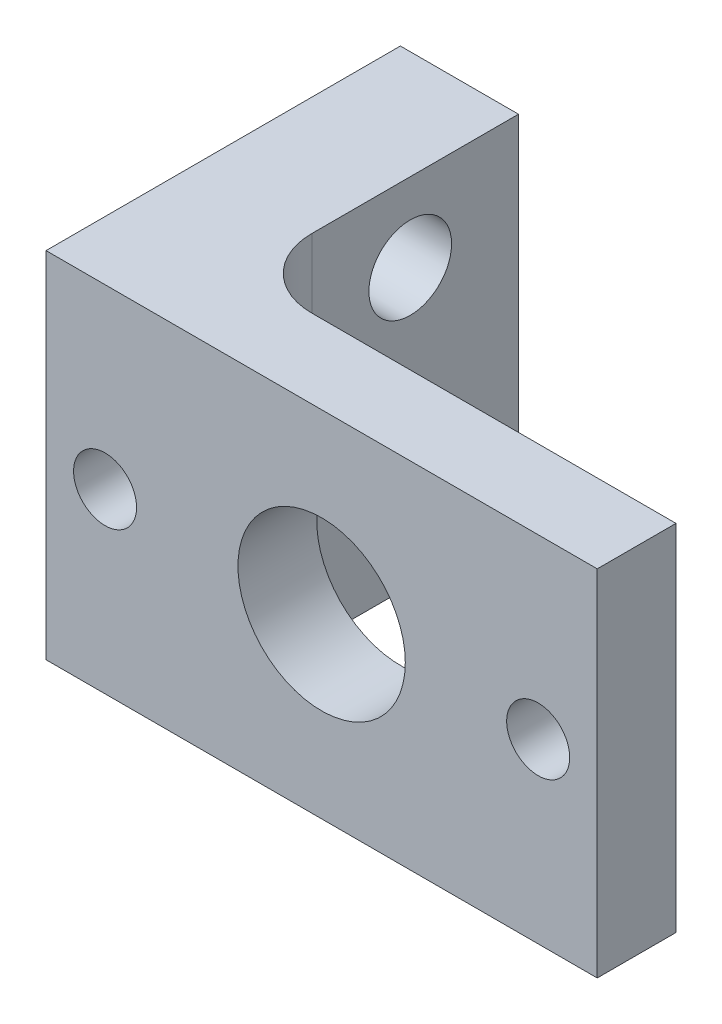
ISO-10303-21;
HEADER;
FILE_DESCRIPTION(('STEP AP214'),'2;1');
FILE_NAME('part.step','',(''),(''),'','','');
FILE_SCHEMA(('AUTOMOTIVE_DESIGN { 1 0 10303 214 1 1 1 1 }'));
ENDSEC;
DATA;
#1=APPLICATION_CONTEXT('core data for automotive mechanical design processes');
#2=APPLICATION_PROTOCOL_DEFINITION('international standard','automotive_design',2000,#1);
#3=PRODUCT_CONTEXT('',#1,'mechanical');
#4=PRODUCT('Part','Part','',(#3));
#5=PRODUCT_RELATED_PRODUCT_CATEGORY('part','',(#4));
#6=PRODUCT_DEFINITION_FORMATION('','',#4);
#7=PRODUCT_DEFINITION_CONTEXT('part definition',#1,'design');
#8=PRODUCT_DEFINITION('design','',#6,#7);
#9=PRODUCT_DEFINITION_SHAPE('','',#8);
#10=(LENGTH_UNIT() NAMED_UNIT(*) SI_UNIT(.MILLI.,.METRE.));
#11=(NAMED_UNIT(*) PLANE_ANGLE_UNIT() SI_UNIT($,.RADIAN.));
#12=(NAMED_UNIT(*) SI_UNIT($,.STERADIAN.) SOLID_ANGLE_UNIT());
#13=UNCERTAINTY_MEASURE_WITH_UNIT(LENGTH_MEASURE(1.E-05),#10,'distance_accuracy_value','');
#14=(GEOMETRIC_REPRESENTATION_CONTEXT(3) GLOBAL_UNCERTAINTY_ASSIGNED_CONTEXT((#13)) GLOBAL_UNIT_ASSIGNED_CONTEXT((#10,
#11,#12)) REPRESENTATION_CONTEXT('',''));
#15=CARTESIAN_POINT('',(0.,0.,0.));
#16=DIRECTION('',(0.,0.,1.));
#17=DIRECTION('',(1.,0.,0.));
#18=AXIS2_PLACEMENT_3D('',#15,#16,#17);
#19=CARTESIAN_POINT('',(6.,18.,-18.));
#20=DIRECTION('',(0.,0.,1.));
#21=DIRECTION('',(1.,0.,0.));
#22=AXIS2_PLACEMENT_3D('',#19,#20,#21);
#23=PLANE('',#22);
#24=CARTESIAN_POINT('',(3.,9.,-18.));
#25=DIRECTION('',(0.,0.,1.));
#26=DIRECTION('',(1.,0.,0.));
#27=AXIS2_PLACEMENT_3D('',#24,#25,#26);
#28=CIRCLE('',#27,1.6);
#29=CARTESIAN_POINT('',(4.6,9.,-18.));
#30=VERTEX_POINT('',#29);
#31=EDGE_CURVE('E137',#30,#30,#28,.T.);
#32=ORIENTED_EDGE('',*,*,#31,.T.);
#33=EDGE_LOOP('',(#32));
#34=FACE_BOUND('',#33,.T.);
#35=DIRECTION('',(-1.,0.,0.));
#36=VECTOR('',#35,1.);
#37=CARTESIAN_POINT('',(6.,0.,-18.));
#38=LINE('',#37,#36);
#39=CARTESIAN_POINT('',(6.,0.,-18.));
#40=VERTEX_POINT('',#39);
#41=CARTESIAN_POINT('',(0.,0.,-18.));
#42=VERTEX_POINT('',#41);
#43=EDGE_CURVE('E118',#40,#42,#38,.T.);
#44=ORIENTED_EDGE('',*,*,#43,.T.);
#45=DIRECTION('',(0.,-1.,0.));
#46=VECTOR('',#45,1.);
#47=CARTESIAN_POINT('',(0.,18.,-18.));
#48=LINE('',#47,#46);
#49=CARTESIAN_POINT('',(0.,18.,-18.));
#50=VERTEX_POINT('',#49);
#51=EDGE_CURVE('E99',#50,#42,#48,.T.);
#52=ORIENTED_EDGE('',*,*,#51,.F.);
#53=DIRECTION('',(-1.,0.,0.));
#54=VECTOR('',#53,1.);
#55=CARTESIAN_POINT('',(6.,18.,-18.));
#56=LINE('',#55,#54);
#57=CARTESIAN_POINT('',(6.,18.,-18.));
#58=VERTEX_POINT('',#57);
#59=EDGE_CURVE('E106',#58,#50,#56,.T.);
#60=ORIENTED_EDGE('',*,*,#59,.F.);
#61=DIRECTION('',(0.,-1.,0.));
#62=VECTOR('',#61,1.);
#63=CARTESIAN_POINT('',(6.,18.,-18.));
#64=LINE('',#63,#62);
#65=EDGE_CURVE('E151',#58,#40,#64,.T.);
#66=ORIENTED_EDGE('',*,*,#65,.T.);
#67=EDGE_LOOP('',(#44,#52,#60,#66));
#68=FACE_BOUND('',#67,.T.);
#69=ADVANCED_FACE('F35',(#34,#68),#23,.F.);
#70=CARTESIAN_POINT('',(0.,18.,-18.));
#71=DIRECTION('',(1.,0.,0.));
#72=DIRECTION('',(0.,0.,-1.));
#73=AXIS2_PLACEMENT_3D('',#70,#71,#72);
#74=PLANE('',#73);
#75=CARTESIAN_POINT('',(0.,4.,-12.5));
#76=DIRECTION('',(1.,0.,0.));
#77=DIRECTION('',(0.,0.,1.));
#78=AXIS2_PLACEMENT_3D('',#75,#76,#77);
#79=CIRCLE('',#78,2.1);
#80=CARTESIAN_POINT('',(0.,4.,-10.4));
#81=VERTEX_POINT('',#80);
#82=EDGE_CURVE('E213',#81,#81,#79,.T.);
#83=ORIENTED_EDGE('',*,*,#82,.T.);
#84=EDGE_LOOP('',(#83));
#85=FACE_BOUND('',#84,.T.);
#86=CARTESIAN_POINT('',(0.,14.,-12.5));
#87=DIRECTION('',(1.,0.,0.));
#88=DIRECTION('',(0.,0.,-1.));
#89=AXIS2_PLACEMENT_3D('',#86,#87,#88);
#90=CIRCLE('',#89,2.1);
#91=CARTESIAN_POINT('',(0.,14.,-14.6));
#92=VERTEX_POINT('',#91);
#93=EDGE_CURVE('E206',#92,#92,#90,.T.);
#94=ORIENTED_EDGE('',*,*,#93,.T.);
#95=EDGE_LOOP('',(#94));
#96=FACE_BOUND('',#95,.T.);
#97=DIRECTION('',(0.,0.,1.));
#98=VECTOR('',#97,1.);
#99=CARTESIAN_POINT('',(0.,0.,-18.));
#100=LINE('',#99,#98);
#101=CARTESIAN_POINT('',(0.,0.,0.));
#102=VERTEX_POINT('',#101);
#103=EDGE_CURVE('E134',#42,#102,#100,.T.);
#104=ORIENTED_EDGE('',*,*,#103,.T.);
#105=DIRECTION('',(0.,-1.,0.));
#106=VECTOR('',#105,1.);
#107=CARTESIAN_POINT('',(0.,18.,0.));
#108=LINE('',#107,#106);
#109=CARTESIAN_POINT('',(0.,18.,0.));
#110=VERTEX_POINT('',#109);
#111=EDGE_CURVE('E102',#110,#102,#108,.T.);
#112=ORIENTED_EDGE('',*,*,#111,.F.);
#113=DIRECTION('',(0.,0.,1.));
#114=VECTOR('',#113,1.);
#115=CARTESIAN_POINT('',(0.,18.,-18.));
#116=LINE('',#115,#114);
#117=EDGE_CURVE('E95',#50,#110,#116,.T.);
#118=ORIENTED_EDGE('',*,*,#117,.F.);
#119=ORIENTED_EDGE('',*,*,#51,.T.);
#120=EDGE_LOOP('',(#104,#112,#118,#119));
#121=FACE_BOUND('',#120,.T.);
#122=ADVANCED_FACE('F97',(#85,#96,#121),#74,.F.);
#123=CARTESIAN_POINT('',(0.,18.,0.));
#124=DIRECTION('',(0.,0.,-1.));
#125=DIRECTION('',(-1.,0.,0.));
#126=AXIS2_PLACEMENT_3D('',#123,#124,#125);
#127=PLANE('',#126);
#128=CARTESIAN_POINT('',(14.,9.,0.));
#129=DIRECTION('',(0.,0.,1.));
#130=DIRECTION('',(1.,0.,0.));
#131=AXIS2_PLACEMENT_3D('',#128,#129,#130);
#132=CIRCLE('',#131,4.25);
#133=CARTESIAN_POINT('',(18.25,9.,0.));
#134=VERTEX_POINT('',#133);
#135=EDGE_CURVE('E221',#134,#134,#132,.T.);
#136=ORIENTED_EDGE('',*,*,#135,.F.);
#137=EDGE_LOOP('',(#136));
#138=FACE_BOUND('',#137,.T.);
#139=CARTESIAN_POINT('',(3.,9.,0.));
#140=DIRECTION('',(0.,0.,1.));
#141=DIRECTION('',(1.,0.,0.));
#142=AXIS2_PLACEMENT_3D('',#139,#140,#141);
#143=CIRCLE('',#142,1.6);
#144=CARTESIAN_POINT('',(4.6,9.,0.));
#145=VERTEX_POINT('',#144);
#146=EDGE_CURVE('E142',#145,#145,#143,.T.);
#147=ORIENTED_EDGE('',*,*,#146,.F.);
#148=EDGE_LOOP('',(#147));
#149=FACE_BOUND('',#148,.T.);
#150=CARTESIAN_POINT('',(25.,9.,0.));
#151=DIRECTION('',(0.,0.,1.));
#152=DIRECTION('',(1.,0.,0.));
#153=AXIS2_PLACEMENT_3D('',#150,#151,#152);
#154=CIRCLE('',#153,1.6);
#155=CARTESIAN_POINT('',(26.6,9.,0.));
#156=VERTEX_POINT('',#155);
#157=EDGE_CURVE('E129',#156,#156,#154,.T.);
#158=ORIENTED_EDGE('',*,*,#157,.F.);
#159=EDGE_LOOP('',(#158));
#160=FACE_BOUND('',#159,.T.);
#161=DIRECTION('',(1.,0.,0.));
#162=VECTOR('',#161,1.);
#163=CARTESIAN_POINT('',(0.,0.,0.));
#164=LINE('',#163,#162);
#165=CARTESIAN_POINT('',(28.,0.,0.));
#166=VERTEX_POINT('',#165);
#167=EDGE_CURVE('E154',#102,#166,#164,.T.);
#168=ORIENTED_EDGE('',*,*,#167,.T.);
#169=DIRECTION('',(0.,-1.,0.));
#170=VECTOR('',#169,1.);
#171=CARTESIAN_POINT('',(28.,18.,0.));
#172=LINE('',#171,#170);
#173=CARTESIAN_POINT('',(28.,18.,0.));
#174=VERTEX_POINT('',#173);
#175=EDGE_CURVE('E123',#174,#166,#172,.T.);
#176=ORIENTED_EDGE('',*,*,#175,.F.);
#177=DIRECTION('',(1.,0.,0.));
#178=VECTOR('',#177,1.);
#179=CARTESIAN_POINT('',(0.,18.,0.));
#180=LINE('',#179,#178);
#181=EDGE_CURVE('E105',#110,#174,#180,.T.);
#182=ORIENTED_EDGE('',*,*,#181,.F.);
#183=ORIENTED_EDGE('',*,*,#111,.T.);
#184=EDGE_LOOP('',(#168,#176,#182,#183));
#185=FACE_BOUND('',#184,.T.);
#186=ADVANCED_FACE('F180',(#138,#149,#160,#185),#127,.F.);
#187=CARTESIAN_POINT('',(28.,18.,0.));
#188=DIRECTION('',(-1.,0.,0.));
#189=DIRECTION('',(0.,0.,1.));
#190=AXIS2_PLACEMENT_3D('',#187,#188,#189);
#191=PLANE('',#190);
#192=DIRECTION('',(0.,0.,-1.));
#193=VECTOR('',#192,1.);
#194=CARTESIAN_POINT('',(28.,0.,0.));
#195=LINE('',#194,#193);
#196=CARTESIAN_POINT('',(28.,0.,-4.));
#197=VERTEX_POINT('',#196);
#198=EDGE_CURVE('E156',#166,#197,#195,.T.);
#199=ORIENTED_EDGE('',*,*,#198,.T.);
#200=DIRECTION('',(0.,-1.,0.));
#201=VECTOR('',#200,1.);
#202=CARTESIAN_POINT('',(28.,18.,-4.));
#203=LINE('',#202,#201);
#204=CARTESIAN_POINT('',(28.,18.,-4.));
#205=VERTEX_POINT('',#204);
#206=EDGE_CURVE('E162',#205,#197,#203,.T.);
#207=ORIENTED_EDGE('',*,*,#206,.F.);
#208=DIRECTION('',(0.,0.,-1.));
#209=VECTOR('',#208,1.);
#210=CARTESIAN_POINT('',(28.,18.,0.));
#211=LINE('',#210,#209);
#212=EDGE_CURVE('E147',#174,#205,#211,.T.);
#213=ORIENTED_EDGE('',*,*,#212,.F.);
#214=ORIENTED_EDGE('',*,*,#175,.T.);
#215=EDGE_LOOP('',(#199,#207,#213,#214));
#216=FACE_BOUND('',#215,.T.);
#217=ADVANCED_FACE('F169',(#216),#191,.F.);
#218=CARTESIAN_POINT('',(28.,18.,-4.));
#219=DIRECTION('',(0.,0.,1.));
#220=DIRECTION('',(1.,0.,0.));
#221=AXIS2_PLACEMENT_3D('',#218,#219,#220);
#222=PLANE('',#221);
#223=CARTESIAN_POINT('',(14.,9.,-4.));
#224=DIRECTION('',(0.,0.,1.));
#225=DIRECTION('',(1.,0.,0.));
#226=AXIS2_PLACEMENT_3D('',#223,#224,#225);
#227=CIRCLE('',#226,4.25);
#228=CARTESIAN_POINT('',(18.25,9.,-4.));
#229=VERTEX_POINT('',#228);
#230=EDGE_CURVE('E39',#229,#229,#227,.T.);
#231=ORIENTED_EDGE('',*,*,#230,.T.);
#232=EDGE_LOOP('',(#231));
#233=FACE_BOUND('',#232,.T.);
#234=CARTESIAN_POINT('',(25.,9.,-4.));
#235=DIRECTION('',(0.,0.,1.));
#236=DIRECTION('',(1.,0.,0.));
#237=AXIS2_PLACEMENT_3D('',#234,#235,#236);
#238=CIRCLE('',#237,1.6);
#239=CARTESIAN_POINT('',(26.6,9.,-4.));
#240=VERTEX_POINT('',#239);
#241=EDGE_CURVE('E127',#240,#240,#238,.T.);
#242=ORIENTED_EDGE('',*,*,#241,.T.);
#243=EDGE_LOOP('',(#242));
#244=FACE_BOUND('',#243,.T.);
#245=DIRECTION('',(-1.,0.,0.));
#246=VECTOR('',#245,1.);
#247=CARTESIAN_POINT('',(28.,0.,-4.));
#248=LINE('',#247,#246);
#249=CARTESIAN_POINT('',(9.5,0.,-4.));
#250=VERTEX_POINT('',#249);
#251=EDGE_CURVE('E158',#197,#250,#248,.T.);
#252=ORIENTED_EDGE('',*,*,#251,.T.);
#253=DIRECTION('',(0.,-1.,0.));
#254=VECTOR('',#253,1.);
#255=CARTESIAN_POINT('',(9.5,18.,-4.));
#256=LINE('',#255,#254);
#257=CARTESIAN_POINT('',(9.5,18.,-4.));
#258=VERTEX_POINT('',#257);
#259=EDGE_CURVE('E51',#250,#258,#256,.F.);
#260=ORIENTED_EDGE('',*,*,#259,.T.);
#261=DIRECTION('',(-1.,0.,0.));
#262=VECTOR('',#261,1.);
#263=CARTESIAN_POINT('',(28.,18.,-4.));
#264=LINE('',#263,#262);
#265=EDGE_CURVE('E149',#205,#258,#264,.T.);
#266=ORIENTED_EDGE('',*,*,#265,.F.);
#267=ORIENTED_EDGE('',*,*,#206,.T.);
#268=EDGE_LOOP('',(#252,#260,#266,#267));
#269=FACE_BOUND('',#268,.T.);
#270=ADVANCED_FACE('F174',(#233,#244,#269),#222,.F.);
#271=CARTESIAN_POINT('',(6.,18.,-4.));
#272=DIRECTION('',(-1.,0.,0.));
#273=DIRECTION('',(0.,0.,1.));
#274=AXIS2_PLACEMENT_3D('',#271,#272,#273);
#275=PLANE('',#274);
#276=CARTESIAN_POINT('',(6.,4.,-12.5));
#277=DIRECTION('',(1.,0.,0.));
#278=DIRECTION('',(0.,0.,1.));
#279=AXIS2_PLACEMENT_3D('',#276,#277,#278);
#280=CIRCLE('',#279,2.1);
#281=CARTESIAN_POINT('',(6.,4.,-10.4));
#282=VERTEX_POINT('',#281);
#283=EDGE_CURVE('E216',#282,#282,#280,.T.);
#284=ORIENTED_EDGE('',*,*,#283,.F.);
#285=EDGE_LOOP('',(#284));
#286=FACE_BOUND('',#285,.T.);
#287=CARTESIAN_POINT('',(6.,14.,-12.5));
#288=DIRECTION('',(1.,0.,0.));
#289=DIRECTION('',(0.,0.,-1.));
#290=AXIS2_PLACEMENT_3D('',#287,#288,#289);
#291=CIRCLE('',#290,2.1);
#292=CARTESIAN_POINT('',(6.,14.,-14.6));
#293=VERTEX_POINT('',#292);
#294=EDGE_CURVE('E208',#293,#293,#291,.T.);
#295=ORIENTED_EDGE('',*,*,#294,.F.);
#296=EDGE_LOOP('',(#295));
#297=FACE_BOUND('',#296,.T.);
#298=DIRECTION('',(0.,0.,-1.));
#299=VECTOR('',#298,1.);
#300=CARTESIAN_POINT('',(6.,18.,-4.));
#301=LINE('',#300,#299);
#302=CARTESIAN_POINT('',(6.,18.,-7.5));
#303=VERTEX_POINT('',#302);
#304=EDGE_CURVE('E111',#303,#58,#301,.T.);
#305=ORIENTED_EDGE('',*,*,#304,.F.);
#306=DIRECTION('',(0.,-1.,0.));
#307=VECTOR('',#306,1.);
#308=CARTESIAN_POINT('',(6.,0.,-7.5));
#309=LINE('',#308,#307);
#310=CARTESIAN_POINT('',(6.,0.,-7.5));
#311=VERTEX_POINT('',#310);
#312=EDGE_CURVE('E119',#303,#311,#309,.T.);
#313=ORIENTED_EDGE('',*,*,#312,.T.);
#314=DIRECTION('',(0.,0.,-1.));
#315=VECTOR('',#314,1.);
#316=CARTESIAN_POINT('',(6.,0.,-4.));
#317=LINE('',#316,#315);
#318=EDGE_CURVE('E115',#311,#40,#317,.T.);
#319=ORIENTED_EDGE('',*,*,#318,.T.);
#320=ORIENTED_EDGE('',*,*,#65,.F.);
#321=EDGE_LOOP('',(#305,#313,#319,#320));
#322=FACE_BOUND('',#321,.T.);
#323=ADVANCED_FACE('F179',(#286,#297,#322),#275,.F.);
#324=CARTESIAN_POINT('',(0.,18.,0.));
#325=DIRECTION('',(0.,1.,0.));
#326=DIRECTION('',(0.,0.,1.));
#327=AXIS2_PLACEMENT_3D('',#324,#325,#326);
#328=PLANE('',#327);
#329=ORIENTED_EDGE('',*,*,#59,.T.);
#330=ORIENTED_EDGE('',*,*,#117,.T.);
#331=ORIENTED_EDGE('',*,*,#181,.T.);
#332=ORIENTED_EDGE('',*,*,#212,.T.);
#333=ORIENTED_EDGE('',*,*,#265,.T.);
#334=CARTESIAN_POINT('',(9.5,18.,-7.5));
#335=DIRECTION('',(0.,1.,0.));
#336=DIRECTION('',(0.,0.,1.));
#337=AXIS2_PLACEMENT_3D('',#334,#335,#336);
#338=CIRCLE('',#337,3.5);
#339=EDGE_CURVE('E11',#258,#303,#338,.F.);
#340=ORIENTED_EDGE('',*,*,#339,.T.);
#341=ORIENTED_EDGE('',*,*,#304,.T.);
#342=EDGE_LOOP('',(#329,#330,#331,#332,#333,#340,#341));
#343=FACE_BOUND('',#342,.T.);
#344=ADVANCED_FACE('F109',(#343),#328,.T.);
#345=CARTESIAN_POINT('',(0.,0.,0.));
#346=DIRECTION('',(0.,1.,0.));
#347=DIRECTION('',(0.,0.,1.));
#348=AXIS2_PLACEMENT_3D('',#345,#346,#347);
#349=PLANE('',#348);
#350=ORIENTED_EDGE('',*,*,#43,.F.);
#351=ORIENTED_EDGE('',*,*,#318,.F.);
#352=CARTESIAN_POINT('',(9.5,0.,-7.5));
#353=DIRECTION('',(0.,1.,0.));
#354=DIRECTION('',(0.,0.,1.));
#355=AXIS2_PLACEMENT_3D('',#352,#353,#354);
#356=CIRCLE('',#355,3.5);
#357=EDGE_CURVE('E44',#311,#250,#356,.T.);
#358=ORIENTED_EDGE('',*,*,#357,.T.);
#359=ORIENTED_EDGE('',*,*,#251,.F.);
#360=ORIENTED_EDGE('',*,*,#198,.F.);
#361=ORIENTED_EDGE('',*,*,#167,.F.);
#362=ORIENTED_EDGE('',*,*,#103,.F.);
#363=EDGE_LOOP('',(#350,#351,#358,#359,#360,#361,#362));
#364=FACE_BOUND('',#363,.T.);
#365=ADVANCED_FACE('F173',(#364),#349,.F.);
#366=CARTESIAN_POINT('',(25.,9.,-18.));
#367=DIRECTION('',(0.,0.,1.));
#368=DIRECTION('',(1.,0.,0.));
#369=AXIS2_PLACEMENT_3D('',#366,#367,#368);
#370=CYLINDRICAL_SURFACE('',#369,1.6);
#371=ORIENTED_EDGE('',*,*,#157,.T.);
#372=EDGE_LOOP('',(#371));
#373=FACE_BOUND('',#372,.T.);
#374=ORIENTED_EDGE('',*,*,#241,.F.);
#375=EDGE_LOOP('',(#374));
#376=FACE_BOUND('',#375,.T.);
#377=ADVANCED_FACE('F202',(#373,#376),#370,.F.);
#378=CARTESIAN_POINT('',(3.,9.,-18.));
#379=DIRECTION('',(0.,0.,1.));
#380=DIRECTION('',(1.,0.,0.));
#381=AXIS2_PLACEMENT_3D('',#378,#379,#380);
#382=CYLINDRICAL_SURFACE('',#381,1.6);
#383=ORIENTED_EDGE('',*,*,#31,.F.);
#384=EDGE_LOOP('',(#383));
#385=FACE_BOUND('',#384,.T.);
#386=ORIENTED_EDGE('',*,*,#146,.T.);
#387=EDGE_LOOP('',(#386));
#388=FACE_BOUND('',#387,.T.);
#389=ADVANCED_FACE('F199',(#385,#388),#382,.F.);
#390=CARTESIAN_POINT('',(9.5,18.,-7.5));
#391=DIRECTION('',(0.,1.,0.));
#392=DIRECTION('',(0.,0.,1.));
#393=AXIS2_PLACEMENT_3D('',#390,#391,#392);
#394=CYLINDRICAL_SURFACE('',#393,3.5);
#395=ORIENTED_EDGE('',*,*,#339,.F.);
#396=ORIENTED_EDGE('',*,*,#259,.F.);
#397=ORIENTED_EDGE('',*,*,#357,.F.);
#398=ORIENTED_EDGE('',*,*,#312,.F.);
#399=EDGE_LOOP('',(#395,#396,#397,#398));
#400=FACE_BOUND('',#399,.T.);
#401=ADVANCED_FACE('F37',(#400),#394,.F.);
#402=CARTESIAN_POINT('',(0.,14.,-12.5));
#403=DIRECTION('',(1.,0.,0.));
#404=DIRECTION('',(0.,0.,-1.));
#405=AXIS2_PLACEMENT_3D('',#402,#403,#404);
#406=CYLINDRICAL_SURFACE('',#405,2.1);
#407=ORIENTED_EDGE('',*,*,#93,.F.);
#408=EDGE_LOOP('',(#407));
#409=FACE_BOUND('',#408,.T.);
#410=ORIENTED_EDGE('',*,*,#294,.T.);
#411=EDGE_LOOP('',(#410));
#412=FACE_BOUND('',#411,.T.);
#413=ADVANCED_FACE('F235',(#409,#412),#406,.F.);
#414=CARTESIAN_POINT('',(0.,4.,-12.5));
#415=DIRECTION('',(1.,0.,0.));
#416=DIRECTION('',(0.,0.,-1.));
#417=AXIS2_PLACEMENT_3D('',#414,#415,#416);
#418=CYLINDRICAL_SURFACE('',#417,2.1);
#419=ORIENTED_EDGE('',*,*,#82,.F.);
#420=EDGE_LOOP('',(#419));
#421=FACE_BOUND('',#420,.T.);
#422=ORIENTED_EDGE('',*,*,#283,.T.);
#423=EDGE_LOOP('',(#422));
#424=FACE_BOUND('',#423,.T.);
#425=ADVANCED_FACE('F230',(#421,#424),#418,.F.);
#426=CARTESIAN_POINT('',(14.,9.,-18.));
#427=DIRECTION('',(0.,0.,1.));
#428=DIRECTION('',(1.,0.,0.));
#429=AXIS2_PLACEMENT_3D('',#426,#427,#428);
#430=CYLINDRICAL_SURFACE('',#429,4.25);
#431=ORIENTED_EDGE('',*,*,#135,.T.);
#432=EDGE_LOOP('',(#431));
#433=FACE_BOUND('',#432,.T.);
#434=ORIENTED_EDGE('',*,*,#230,.F.);
#435=EDGE_LOOP('',(#434));
#436=FACE_BOUND('',#435,.T.);
#437=ADVANCED_FACE('F228',(#433,#436),#430,.F.);
#438=CLOSED_SHELL('',(#69,#122,#186,#217,#270,#323,#344,#365,#377,#389,#401,#413,#425,#437));
#439=MANIFOLD_SOLID_BREP('B2',#438);
#440=ADVANCED_BREP_SHAPE_REPRESENTATION('',(#18,#439),#14);
#441=SHAPE_DEFINITION_REPRESENTATION(#9,#440);
ENDSEC;
END-ISO-10303-21;
